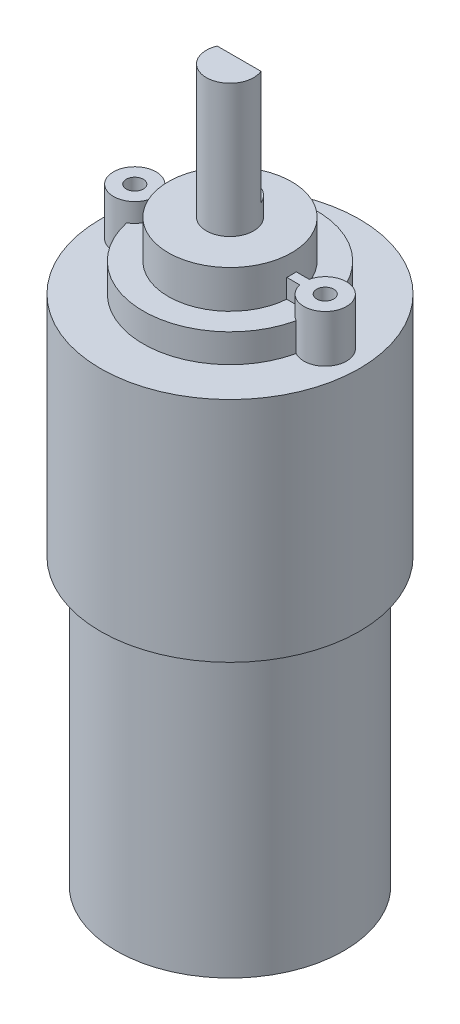
ISO-10303-21;
HEADER;
FILE_DESCRIPTION(('STEP AP214'),'2;1');
FILE_NAME('part.step','',(''),(''),'','','');
FILE_SCHEMA(('AUTOMOTIVE_DESIGN { 1 0 10303 214 1 1 1 1 }'));
ENDSEC;
DATA;
#1=APPLICATION_CONTEXT('core data for automotive mechanical design processes');
#2=APPLICATION_PROTOCOL_DEFINITION('international standard','automotive_design',2000,#1);
#3=PRODUCT_CONTEXT('',#1,'mechanical');
#4=PRODUCT('Part','Part','',(#3));
#5=PRODUCT_RELATED_PRODUCT_CATEGORY('part','',(#4));
#6=PRODUCT_DEFINITION_FORMATION('','',#4);
#7=PRODUCT_DEFINITION_CONTEXT('part definition',#1,'design');
#8=PRODUCT_DEFINITION('design','',#6,#7);
#9=PRODUCT_DEFINITION_SHAPE('','',#8);
#10=(LENGTH_UNIT() NAMED_UNIT(*) SI_UNIT(.MILLI.,.METRE.));
#11=(NAMED_UNIT(*) PLANE_ANGLE_UNIT() SI_UNIT($,.RADIAN.));
#12=(NAMED_UNIT(*) SI_UNIT($,.STERADIAN.) SOLID_ANGLE_UNIT());
#13=UNCERTAINTY_MEASURE_WITH_UNIT(LENGTH_MEASURE(1.E-05),#10,'distance_accuracy_value','');
#14=(GEOMETRIC_REPRESENTATION_CONTEXT(3) GLOBAL_UNCERTAINTY_ASSIGNED_CONTEXT((#13)) GLOBAL_UNIT_ASSIGNED_CONTEXT((#10,
#11,#12)) REPRESENTATION_CONTEXT('',''));
#15=CARTESIAN_POINT('',(0.,0.,0.));
#16=DIRECTION('',(0.,0.,1.));
#17=DIRECTION('',(1.,0.,0.));
#18=AXIS2_PLACEMENT_3D('',#15,#16,#17);
#19=CARTESIAN_POINT('',(0.,26.5,0.));
#20=DIRECTION('',(0.,1.,0.));
#21=DIRECTION('',(0.,0.,1.));
#22=AXIS2_PLACEMENT_3D('',#19,#20,#21);
#23=PLANE('',#22);
#24=DIRECTION('',(1.,0.,0.));
#25=VECTOR('',#24,1.);
#26=CARTESIAN_POINT('',(0.,26.5,0.500000000000004));
#27=LINE('',#26,#25);
#28=CARTESIAN_POINT('',(6.48074069840786,26.5,0.500000000000004));
#29=VERTEX_POINT('',#28);
#30=CARTESIAN_POINT('',(7.84625890315197,26.5,0.500000000000004));
#31=VERTEX_POINT('',#30);
#32=EDGE_CURVE('E162',#29,#31,#27,.T.);
#33=ORIENTED_EDGE('',*,*,#32,.F.);
#34=CARTESIAN_POINT('',(0.,26.5,0.));
#35=DIRECTION('',(0.,1.,0.));
#36=DIRECTION('',(0.,0.,1.));
#37=AXIS2_PLACEMENT_3D('',#34,#35,#36);
#38=CIRCLE('',#37,6.5);
#39=CARTESIAN_POINT('',(-6.48074069840786,26.5,0.500000000000004));
#40=VERTEX_POINT('',#39);
#41=EDGE_CURVE('E279',#40,#29,#38,.T.);
#42=ORIENTED_EDGE('',*,*,#41,.F.);
#43=CARTESIAN_POINT('',(-7.84625890315197,26.5,0.500000000000004));
#44=VERTEX_POINT('',#43);
#45=EDGE_CURVE('E305',#44,#40,#27,.T.);
#46=ORIENTED_EDGE('',*,*,#45,.F.);
#47=CARTESIAN_POINT('',(-10.04,26.5,0.));
#48=DIRECTION('',(0.,1.,0.));
#49=DIRECTION('',(0.,0.,1.));
#50=AXIS2_PLACEMENT_3D('',#47,#48,#49);
#51=CIRCLE('',#50,2.25);
#52=CARTESIAN_POINT('',(-8.93733067729084,26.5,1.96128028714819));
#53=VERTEX_POINT('',#52);
#54=EDGE_CURVE('E218',#44,#53,#51,.F.);
#55=ORIENTED_EDGE('',*,*,#54,.T.);
#56=CARTESIAN_POINT('',(0.,26.5,0.));
#57=DIRECTION('',(0.,1.,0.));
#58=DIRECTION('',(0.,0.,1.));
#59=AXIS2_PLACEMENT_3D('',#56,#57,#58);
#60=CIRCLE('',#59,9.15);
#61=CARTESIAN_POINT('',(8.93733067729083,26.5,1.9612802871482));
#62=VERTEX_POINT('',#61);
#63=EDGE_CURVE('E274',#53,#62,#60,.T.);
#64=ORIENTED_EDGE('',*,*,#63,.T.);
#65=CARTESIAN_POINT('',(10.04,26.5,0.));
#66=DIRECTION('',(0.,1.,0.));
#67=DIRECTION('',(0.,0.,1.));
#68=AXIS2_PLACEMENT_3D('',#65,#66,#67);
#69=CIRCLE('',#68,2.25);
#70=EDGE_CURVE('E233',#31,#62,#69,.T.);
#71=ORIENTED_EDGE('',*,*,#70,.F.);
#72=EDGE_LOOP('',(#33,#42,#46,#55,#64,#71));
#73=FACE_BOUND('',#72,.T.);
#74=ADVANCED_FACE('F35',(#73),#23,.T.);
#75=CARTESIAN_POINT('',(8.93733067729083,26.5,-1.9612802871482));
#76=VERTEX_POINT('',#75);
#77=CARTESIAN_POINT('',(7.84625890315197,26.5,-0.499999999999999));
#78=VERTEX_POINT('',#77);
#79=EDGE_CURVE('E236',#76,#78,#69,.T.);
#80=ORIENTED_EDGE('',*,*,#79,.F.);
#81=CARTESIAN_POINT('',(-8.93733067729083,26.5,-1.9612802871482));
#82=VERTEX_POINT('',#81);
#83=EDGE_CURVE('E327',#76,#82,#60,.T.);
#84=ORIENTED_EDGE('',*,*,#83,.T.);
#85=CARTESIAN_POINT('',(-7.84625890315197,26.5,-0.499999999999999));
#86=VERTEX_POINT('',#85);
#87=EDGE_CURVE('E214',#82,#86,#51,.F.);
#88=ORIENTED_EDGE('',*,*,#87,.T.);
#89=DIRECTION('',(1.,0.,0.));
#90=VECTOR('',#89,1.);
#91=CARTESIAN_POINT('',(0.,26.5,-0.499999999999999));
#92=LINE('',#91,#90);
#93=CARTESIAN_POINT('',(-6.48074069840786,26.5,-0.499999999999999));
#94=VERTEX_POINT('',#93);
#95=EDGE_CURVE('E303',#86,#94,#92,.T.);
#96=ORIENTED_EDGE('',*,*,#95,.T.);
#97=CARTESIAN_POINT('',(6.48074069840786,26.5,-0.499999999999999));
#98=VERTEX_POINT('',#97);
#99=EDGE_CURVE('E281',#98,#94,#38,.T.);
#100=ORIENTED_EDGE('',*,*,#99,.F.);
#101=EDGE_CURVE('E306',#98,#78,#92,.T.);
#102=ORIENTED_EDGE('',*,*,#101,.T.);
#103=EDGE_LOOP('',(#80,#84,#88,#96,#100,#102));
#104=FACE_BOUND('',#103,.T.);
#105=ADVANCED_FACE('F313',(#104),#23,.T.);
#106=CARTESIAN_POINT('',(0.,65.6871565633395,0.));
#107=DIRECTION('',(0.,1.,0.));
#108=DIRECTION('',(0.,0.,1.));
#109=AXIS2_PLACEMENT_3D('',#106,#107,#108);
#110=CYLINDRICAL_SURFACE('',#109,9.15);
#111=DIRECTION('',(0.,-1.,0.));
#112=VECTOR('',#111,1.);
#113=CARTESIAN_POINT('',(8.93733067729083,25.,-1.9612802871482));
#114=LINE('',#113,#112);
#115=CARTESIAN_POINT('',(8.93733067729083,23.5,-1.9612802871482));
#116=VERTEX_POINT('',#115);
#117=EDGE_CURVE('E235',#116,#76,#114,.F.);
#118=ORIENTED_EDGE('',*,*,#117,.F.);
#119=CARTESIAN_POINT('',(0.,23.5,0.));
#120=DIRECTION('',(0.,1.,0.));
#121=DIRECTION('',(0.,0.,1.));
#122=AXIS2_PLACEMENT_3D('',#119,#120,#121);
#123=CIRCLE('',#122,9.15);
#124=CARTESIAN_POINT('',(-8.93733067729083,23.5,-1.9612802871482));
#125=VERTEX_POINT('',#124);
#126=EDGE_CURVE('E334',#116,#125,#123,.T.);
#127=ORIENTED_EDGE('',*,*,#126,.T.);
#128=DIRECTION('',(0.,-1.,0.));
#129=VECTOR('',#128,1.);
#130=CARTESIAN_POINT('',(-8.93733067729083,25.,-1.9612802871482));
#131=LINE('',#130,#129);
#132=EDGE_CURVE('E211',#125,#82,#131,.F.);
#133=ORIENTED_EDGE('',*,*,#132,.T.);
#134=ORIENTED_EDGE('',*,*,#83,.F.);
#135=EDGE_LOOP('',(#118,#127,#133,#134));
#136=FACE_BOUND('',#135,.T.);
#137=ADVANCED_FACE('F333',(#136),#110,.T.);
#138=DIRECTION('',(0.,-1.,0.));
#139=VECTOR('',#138,1.);
#140=CARTESIAN_POINT('',(8.93733067729083,25.,1.9612802871482));
#141=LINE('',#140,#139);
#142=CARTESIAN_POINT('',(8.93733067729083,23.5,1.9612802871482));
#143=VERTEX_POINT('',#142);
#144=EDGE_CURVE('E230',#62,#143,#141,.T.);
#145=ORIENTED_EDGE('',*,*,#144,.F.);
#146=ORIENTED_EDGE('',*,*,#63,.F.);
#147=DIRECTION('',(0.,-1.,0.));
#148=VECTOR('',#147,1.);
#149=CARTESIAN_POINT('',(-8.93733067729083,25.,1.9612802871482));
#150=LINE('',#149,#148);
#151=CARTESIAN_POINT('',(-8.93733067729083,23.5,1.9612802871482));
#152=VERTEX_POINT('',#151);
#153=EDGE_CURVE('E217',#53,#152,#150,.T.);
#154=ORIENTED_EDGE('',*,*,#153,.T.);
#155=EDGE_CURVE('E269',#152,#143,#123,.T.);
#156=ORIENTED_EDGE('',*,*,#155,.T.);
#157=EDGE_LOOP('',(#145,#146,#154,#156));
#158=FACE_BOUND('',#157,.T.);
#159=ADVANCED_FACE('F373',(#158),#110,.T.);
#160=CARTESIAN_POINT('',(0.,23.5,0.));
#161=DIRECTION('',(0.,1.,0.));
#162=DIRECTION('',(0.,0.,1.));
#163=AXIS2_PLACEMENT_3D('',#160,#161,#162);
#164=PLANE('',#163);
#165=CARTESIAN_POINT('',(0.,23.5,0.));
#166=DIRECTION('',(0.,1.,0.));
#167=DIRECTION('',(0.,0.,1.));
#168=AXIS2_PLACEMENT_3D('',#165,#166,#167);
#169=CIRCLE('',#168,13.65);
#170=CARTESIAN_POINT('',(0.,23.5,13.65));
#171=VERTEX_POINT('',#170);
#172=EDGE_CURVE('E266',#171,#171,#169,.T.);
#173=ORIENTED_EDGE('',*,*,#172,.T.);
#174=EDGE_LOOP('',(#173));
#175=FACE_BOUND('',#174,.T.);
#176=CARTESIAN_POINT('',(10.04,23.5,0.));
#177=DIRECTION('',(0.,1.,0.));
#178=DIRECTION('',(0.,0.,1.));
#179=AXIS2_PLACEMENT_3D('',#176,#177,#178);
#180=CIRCLE('',#179,2.25);
#181=EDGE_CURVE('E300',#143,#116,#180,.T.);
#182=ORIENTED_EDGE('',*,*,#181,.F.);
#183=ORIENTED_EDGE('',*,*,#155,.F.);
#184=CARTESIAN_POINT('',(-10.04,23.5,0.));
#185=DIRECTION('',(0.,1.,0.));
#186=DIRECTION('',(0.,0.,1.));
#187=AXIS2_PLACEMENT_3D('',#184,#185,#186);
#188=CIRCLE('',#187,2.25);
#189=EDGE_CURVE('E294',#152,#125,#188,.F.);
#190=ORIENTED_EDGE('',*,*,#189,.T.);
#191=ORIENTED_EDGE('',*,*,#126,.F.);
#192=EDGE_LOOP('',(#182,#183,#190,#191));
#193=FACE_BOUND('',#192,.T.);
#194=ADVANCED_FACE('F362',(#175,#193),#164,.T.);
#195=CARTESIAN_POINT('',(0.,44.5,0.));
#196=DIRECTION('',(0.,1.,0.));
#197=DIRECTION('',(0.,0.,1.));
#198=AXIS2_PLACEMENT_3D('',#195,#196,#197);
#199=PLANE('',#198);
#200=DIRECTION('',(1.,0.,0.));
#201=VECTOR('',#200,1.);
#202=CARTESIAN_POINT('',(0.,44.5,-0.96));
#203=LINE('',#202,#201);
#204=CARTESIAN_POINT('',(-2.30833273164854,44.5,-0.96));
#205=VERTEX_POINT('',#204);
#206=CARTESIAN_POINT('',(2.30833273164854,44.5,-0.96));
#207=VERTEX_POINT('',#206);
#208=EDGE_CURVE('E246',#205,#207,#203,.T.);
#209=ORIENTED_EDGE('',*,*,#208,.F.);
#210=CARTESIAN_POINT('',(0.,44.5,0.));
#211=DIRECTION('',(0.,1.,0.));
#212=DIRECTION('',(0.,0.,1.));
#213=AXIS2_PLACEMENT_3D('',#210,#211,#212);
#214=CIRCLE('',#213,2.5);
#215=EDGE_CURVE('E288',#205,#207,#214,.T.);
#216=ORIENTED_EDGE('',*,*,#215,.T.);
#217=EDGE_LOOP('',(#209,#216));
#218=FACE_BOUND('',#217,.T.);
#219=ADVANCED_FACE('F37',(#218),#199,.T.);
#220=CARTESIAN_POINT('',(0.,65.6871565633395,0.));
#221=DIRECTION('',(0.,1.,0.));
#222=DIRECTION('',(0.,0.,1.));
#223=AXIS2_PLACEMENT_3D('',#220,#221,#222);
#224=CYLINDRICAL_SURFACE('',#223,2.5);
#225=DIRECTION('',(0.,1.,0.));
#226=VECTOR('',#225,1.);
#227=CARTESIAN_POINT('',(2.30833273164854,32.5,-0.96));
#228=LINE('',#227,#226);
#229=CARTESIAN_POINT('',(2.30833273164854,32.5,-0.96));
#230=VERTEX_POINT('',#229);
#231=EDGE_CURVE('E253',#230,#207,#228,.T.);
#232=ORIENTED_EDGE('',*,*,#231,.T.);
#233=ORIENTED_EDGE('',*,*,#215,.F.);
#234=DIRECTION('',(0.,1.,0.));
#235=VECTOR('',#234,1.);
#236=CARTESIAN_POINT('',(-2.30833273164854,32.5,-0.96));
#237=LINE('',#236,#235);
#238=CARTESIAN_POINT('',(-2.30833273164854,32.5,-0.96));
#239=VERTEX_POINT('',#238);
#240=EDGE_CURVE('E251',#239,#205,#237,.T.);
#241=ORIENTED_EDGE('',*,*,#240,.F.);
#242=CARTESIAN_POINT('',(0.,32.5,0.));
#243=DIRECTION('',(0.,1.,0.));
#244=DIRECTION('',(0.,0.,1.));
#245=AXIS2_PLACEMENT_3D('',#242,#243,#244);
#246=CIRCLE('',#245,2.5);
#247=EDGE_CURVE('E247',#230,#239,#246,.T.);
#248=ORIENTED_EDGE('',*,*,#247,.F.);
#249=EDGE_LOOP('',(#232,#233,#241,#248));
#250=FACE_BOUND('',#249,.T.);
#251=CARTESIAN_POINT('',(0.,30.5,0.));
#252=DIRECTION('',(0.,1.,0.));
#253=DIRECTION('',(0.,0.,1.));
#254=AXIS2_PLACEMENT_3D('',#251,#252,#253);
#255=CIRCLE('',#254,2.5);
#256=CARTESIAN_POINT('',(0.,30.5,2.5));
#257=VERTEX_POINT('',#256);
#258=EDGE_CURVE('E285',#257,#257,#255,.T.);
#259=ORIENTED_EDGE('',*,*,#258,.T.);
#260=EDGE_LOOP('',(#259));
#261=FACE_BOUND('',#260,.T.);
#262=ADVANCED_FACE('F569',(#250,#261),#224,.T.);
#263=CARTESIAN_POINT('',(0.,30.5,0.));
#264=DIRECTION('',(0.,1.,0.));
#265=DIRECTION('',(0.,0.,1.));
#266=AXIS2_PLACEMENT_3D('',#263,#264,#265);
#267=PLANE('',#266);
#268=CARTESIAN_POINT('',(0.,30.5,0.));
#269=DIRECTION('',(0.,1.,0.));
#270=DIRECTION('',(0.,0.,1.));
#271=AXIS2_PLACEMENT_3D('',#268,#269,#270);
#272=CIRCLE('',#271,6.5);
#273=CARTESIAN_POINT('',(0.,30.5,6.5));
#274=VERTEX_POINT('',#273);
#275=EDGE_CURVE('E282',#274,#274,#272,.T.);
#276=ORIENTED_EDGE('',*,*,#275,.T.);
#277=EDGE_LOOP('',(#276));
#278=FACE_BOUND('',#277,.T.);
#279=ORIENTED_EDGE('',*,*,#258,.F.);
#280=EDGE_LOOP('',(#279));
#281=FACE_BOUND('',#280,.T.);
#282=ADVANCED_FACE('F513',(#278,#281),#267,.T.);
#283=CARTESIAN_POINT('',(0.,65.6871565633395,0.));
#284=DIRECTION('',(0.,1.,0.));
#285=DIRECTION('',(0.,0.,1.));
#286=AXIS2_PLACEMENT_3D('',#283,#284,#285);
#287=CYLINDRICAL_SURFACE('',#286,6.5);
#288=DIRECTION('',(0.,1.,0.));
#289=VECTOR('',#288,1.);
#290=CARTESIAN_POINT('',(-6.48074069840786,65.6871565633395,0.500000000000004));
#291=LINE('',#290,#289);
#292=CARTESIAN_POINT('',(-6.48074069840786,28.5,0.500000000000004));
#293=VERTEX_POINT('',#292);
#294=EDGE_CURVE('E244',#40,#293,#291,.T.);
#295=ORIENTED_EDGE('',*,*,#294,.F.);
#296=ORIENTED_EDGE('',*,*,#41,.T.);
#297=DIRECTION('',(0.,1.,0.));
#298=VECTOR('',#297,1.);
#299=CARTESIAN_POINT('',(6.48074069840786,65.6871565633395,0.500000000000004));
#300=LINE('',#299,#298);
#301=CARTESIAN_POINT('',(6.48074069840786,28.5,0.500000000000004));
#302=VERTEX_POINT('',#301);
#303=EDGE_CURVE('E50',#302,#29,#300,.F.);
#304=ORIENTED_EDGE('',*,*,#303,.F.);
#305=CARTESIAN_POINT('',(0.,28.5,0.));
#306=DIRECTION('',(0.,1.,0.));
#307=DIRECTION('',(0.,0.,1.));
#308=AXIS2_PLACEMENT_3D('',#305,#306,#307);
#309=CIRCLE('',#308,6.5);
#310=CARTESIAN_POINT('',(6.48074069840786,28.5,-0.499999999999999));
#311=VERTEX_POINT('',#310);
#312=EDGE_CURVE('E39',#311,#302,#309,.F.);
#313=ORIENTED_EDGE('',*,*,#312,.F.);
#314=DIRECTION('',(0.,1.,0.));
#315=VECTOR('',#314,1.);
#316=CARTESIAN_POINT('',(6.48074069840786,65.6871565633395,-0.499999999999999));
#317=LINE('',#316,#315);
#318=EDGE_CURVE('E238',#311,#98,#317,.F.);
#319=ORIENTED_EDGE('',*,*,#318,.T.);
#320=ORIENTED_EDGE('',*,*,#99,.T.);
#321=DIRECTION('',(0.,1.,0.));
#322=VECTOR('',#321,1.);
#323=CARTESIAN_POINT('',(-6.48074069840786,65.6871565633395,-0.499999999999999));
#324=LINE('',#323,#322);
#325=CARTESIAN_POINT('',(-6.48074069840786,28.5,-0.499999999999999));
#326=VERTEX_POINT('',#325);
#327=EDGE_CURVE('E240',#94,#326,#324,.T.);
#328=ORIENTED_EDGE('',*,*,#327,.T.);
#329=EDGE_CURVE('E11',#293,#326,#309,.F.);
#330=ORIENTED_EDGE('',*,*,#329,.F.);
#331=EDGE_LOOP('',(#295,#296,#304,#313,#319,#320,#328,#330));
#332=FACE_BOUND('',#331,.T.);
#333=ORIENTED_EDGE('',*,*,#275,.F.);
#334=EDGE_LOOP('',(#333));
#335=FACE_BOUND('',#334,.T.);
#336=ADVANCED_FACE('F320',(#332,#335),#287,.T.);
#337=CARTESIAN_POINT('',(0.,65.6871565633395,0.));
#338=DIRECTION('',(0.,1.,0.));
#339=DIRECTION('',(0.,0.,1.));
#340=AXIS2_PLACEMENT_3D('',#337,#338,#339);
#341=CYLINDRICAL_SURFACE('',#340,13.65);
#342=CARTESIAN_POINT('',(0.,-0.5,0.));
#343=DIRECTION('',(0.,1.,0.));
#344=DIRECTION('',(0.,0.,1.));
#345=AXIS2_PLACEMENT_3D('',#342,#343,#344);
#346=CIRCLE('',#345,13.65);
#347=CARTESIAN_POINT('',(0.,-0.5,13.65));
#348=VERTEX_POINT('',#347);
#349=EDGE_CURVE('E263',#348,#348,#346,.T.);
#350=ORIENTED_EDGE('',*,*,#349,.T.);
#351=EDGE_LOOP('',(#350));
#352=FACE_BOUND('',#351,.T.);
#353=ORIENTED_EDGE('',*,*,#172,.F.);
#354=EDGE_LOOP('',(#353));
#355=FACE_BOUND('',#354,.T.);
#356=ADVANCED_FACE('F512',(#352,#355),#341,.T.);
#357=CARTESIAN_POINT('',(0.,-0.5,0.));
#358=DIRECTION('',(0.,-1.,0.));
#359=DIRECTION('',(0.,0.,-1.));
#360=AXIS2_PLACEMENT_3D('',#357,#358,#359);
#361=PLANE('',#360);
#362=CARTESIAN_POINT('',(0.,-0.5,0.));
#363=DIRECTION('',(0.,1.,0.));
#364=DIRECTION('',(0.,0.,1.));
#365=AXIS2_PLACEMENT_3D('',#362,#363,#364);
#366=CIRCLE('',#365,12.);
#367=CARTESIAN_POINT('',(0.,-0.5,12.));
#368=VERTEX_POINT('',#367);
#369=EDGE_CURVE('E260',#368,#368,#366,.T.);
#370=ORIENTED_EDGE('',*,*,#369,.T.);
#371=EDGE_LOOP('',(#370));
#372=FACE_BOUND('',#371,.T.);
#373=ORIENTED_EDGE('',*,*,#349,.F.);
#374=EDGE_LOOP('',(#373));
#375=FACE_BOUND('',#374,.T.);
#376=ADVANCED_FACE('F598',(#372,#375),#361,.T.);
#377=CARTESIAN_POINT('',(0.,65.6871565633395,0.));
#378=DIRECTION('',(0.,1.,0.));
#379=DIRECTION('',(0.,0.,1.));
#380=AXIS2_PLACEMENT_3D('',#377,#378,#379);
#381=CYLINDRICAL_SURFACE('',#380,12.);
#382=CARTESIAN_POINT('',(0.,-30.5,0.));
#383=DIRECTION('',(0.,1.,0.));
#384=DIRECTION('',(0.,0.,1.));
#385=AXIS2_PLACEMENT_3D('',#382,#383,#384);
#386=CIRCLE('',#385,12.);
#387=CARTESIAN_POINT('',(0.,-30.5,12.));
#388=VERTEX_POINT('',#387);
#389=EDGE_CURVE('E256',#388,#388,#386,.T.);
#390=ORIENTED_EDGE('',*,*,#389,.T.);
#391=EDGE_LOOP('',(#390));
#392=FACE_BOUND('',#391,.T.);
#393=ORIENTED_EDGE('',*,*,#369,.F.);
#394=EDGE_LOOP('',(#393));
#395=FACE_BOUND('',#394,.T.);
#396=ADVANCED_FACE('F588',(#392,#395),#381,.T.);
#397=CARTESIAN_POINT('',(0.,-30.5,0.));
#398=DIRECTION('',(0.,-1.,0.));
#399=DIRECTION('',(0.,0.,-1.));
#400=AXIS2_PLACEMENT_3D('',#397,#398,#399);
#401=PLANE('',#400);
#402=ORIENTED_EDGE('',*,*,#389,.F.);
#403=EDGE_LOOP('',(#402));
#404=FACE_BOUND('',#403,.T.);
#405=ADVANCED_FACE('F561',(#404),#401,.T.);
#406=CARTESIAN_POINT('',(0.,32.5,-0.96));
#407=DIRECTION('',(0.,0.,1.));
#408=DIRECTION('',(1.,0.,0.));
#409=AXIS2_PLACEMENT_3D('',#406,#407,#408);
#410=PLANE('',#409);
#411=ORIENTED_EDGE('',*,*,#208,.T.);
#412=ORIENTED_EDGE('',*,*,#231,.F.);
#413=DIRECTION('',(1.,0.,0.));
#414=VECTOR('',#413,1.);
#415=CARTESIAN_POINT('',(0.,32.5,-0.96));
#416=LINE('',#415,#414);
#417=EDGE_CURVE('E249',#239,#230,#416,.T.);
#418=ORIENTED_EDGE('',*,*,#417,.F.);
#419=ORIENTED_EDGE('',*,*,#240,.T.);
#420=EDGE_LOOP('',(#411,#412,#418,#419));
#421=FACE_BOUND('',#420,.T.);
#422=ADVANCED_FACE('F551',(#421),#410,.F.);
#423=CARTESIAN_POINT('',(0.,32.5,0.));
#424=DIRECTION('',(0.,1.,0.));
#425=DIRECTION('',(0.,0.,1.));
#426=AXIS2_PLACEMENT_3D('',#423,#424,#425);
#427=PLANE('',#426);
#428=ORIENTED_EDGE('',*,*,#247,.T.);
#429=ORIENTED_EDGE('',*,*,#417,.T.);
#430=EDGE_LOOP('',(#428,#429));
#431=FACE_BOUND('',#430,.T.);
#432=ADVANCED_FACE('F502',(#431),#427,.T.);
#433=CARTESIAN_POINT('',(-10.04,28.5,0.));
#434=DIRECTION('',(0.,-1.,0.));
#435=DIRECTION('',(0.,0.,-1.));
#436=AXIS2_PLACEMENT_3D('',#433,#434,#435);
#437=CYLINDRICAL_SURFACE('',#436,2.25);
#438=ORIENTED_EDGE('',*,*,#54,.F.);
#439=DIRECTION('',(0.,-1.,0.));
#440=VECTOR('',#439,1.);
#441=CARTESIAN_POINT('',(-7.84625890315197,28.5,0.500000000000004));
#442=LINE('',#441,#440);
#443=CARTESIAN_POINT('',(-7.84625890315197,28.5,0.500000000000004));
#444=VERTEX_POINT('',#443);
#445=EDGE_CURVE('E196',#444,#44,#442,.T.);
#446=ORIENTED_EDGE('',*,*,#445,.F.);
#447=CARTESIAN_POINT('',(-10.04,28.5,0.));
#448=DIRECTION('',(0.,1.,0.));
#449=DIRECTION('',(0.,0.,1.));
#450=AXIS2_PLACEMENT_3D('',#447,#448,#449);
#451=CIRCLE('',#450,2.25);
#452=CARTESIAN_POINT('',(-7.84625890315197,28.5,-0.499999999999999));
#453=VERTEX_POINT('',#452);
#454=EDGE_CURVE('E187',#453,#444,#451,.T.);
#455=ORIENTED_EDGE('',*,*,#454,.F.);
#456=DIRECTION('',(0.,-1.,0.));
#457=VECTOR('',#456,1.);
#458=CARTESIAN_POINT('',(-7.84625890315197,28.5,-0.499999999999999));
#459=LINE('',#458,#457);
#460=EDGE_CURVE('E199',#453,#86,#459,.T.);
#461=ORIENTED_EDGE('',*,*,#460,.T.);
#462=ORIENTED_EDGE('',*,*,#87,.F.);
#463=ORIENTED_EDGE('',*,*,#132,.F.);
#464=ORIENTED_EDGE('',*,*,#189,.F.);
#465=ORIENTED_EDGE('',*,*,#153,.F.);
#466=EDGE_LOOP('',(#438,#446,#455,#461,#462,#463,#464,#465));
#467=FACE_BOUND('',#466,.T.);
#468=ADVANCED_FACE('F329',(#467),#437,.T.);
#469=CARTESIAN_POINT('',(0.,28.5,-0.499999999999999));
#470=DIRECTION('',(0.,0.,1.));
#471=DIRECTION('',(1.,0.,0.));
#472=AXIS2_PLACEMENT_3D('',#469,#470,#471);
#473=PLANE('',#472);
#474=ORIENTED_EDGE('',*,*,#327,.F.);
#475=ORIENTED_EDGE('',*,*,#95,.F.);
#476=ORIENTED_EDGE('',*,*,#460,.F.);
#477=DIRECTION('',(-1.,0.,0.));
#478=VECTOR('',#477,1.);
#479=CARTESIAN_POINT('',(0.,28.5,-0.499999999999999));
#480=LINE('',#479,#478);
#481=EDGE_CURVE('E182',#326,#453,#480,.T.);
#482=ORIENTED_EDGE('',*,*,#481,.F.);
#483=EDGE_LOOP('',(#474,#475,#476,#482));
#484=FACE_BOUND('',#483,.T.);
#485=ADVANCED_FACE('F325',(#484),#473,.F.);
#486=CARTESIAN_POINT('',(0.,28.5,0.500000000000004));
#487=DIRECTION('',(0.,0.,1.));
#488=DIRECTION('',(1.,0.,0.));
#489=AXIS2_PLACEMENT_3D('',#486,#487,#488);
#490=PLANE('',#489);
#491=ORIENTED_EDGE('',*,*,#45,.T.);
#492=ORIENTED_EDGE('',*,*,#294,.T.);
#493=DIRECTION('',(-1.,0.,0.));
#494=VECTOR('',#493,1.);
#495=CARTESIAN_POINT('',(0.,28.5,0.500000000000004));
#496=LINE('',#495,#494);
#497=EDGE_CURVE('E175',#293,#444,#496,.T.);
#498=ORIENTED_EDGE('',*,*,#497,.T.);
#499=ORIENTED_EDGE('',*,*,#445,.T.);
#500=EDGE_LOOP('',(#491,#492,#498,#499));
#501=FACE_BOUND('',#500,.T.);
#502=ADVANCED_FACE('F389',(#501),#490,.T.);
#503=CARTESIAN_POINT('',(-10.04,28.5,0.));
#504=DIRECTION('',(0.,-1.,0.));
#505=DIRECTION('',(0.,0.,-1.));
#506=AXIS2_PLACEMENT_3D('',#503,#504,#505);
#507=CYLINDRICAL_SURFACE('',#506,0.9);
#508=CARTESIAN_POINT('',(-10.04,28.5,0.));
#509=DIRECTION('',(0.,1.,0.));
#510=DIRECTION('',(0.,0.,1.));
#511=AXIS2_PLACEMENT_3D('',#508,#509,#510);
#512=CIRCLE('',#511,0.9);
#513=CARTESIAN_POINT('',(-10.04,28.5,0.900000000000001));
#514=VERTEX_POINT('',#513);
#515=EDGE_CURVE('E193',#514,#514,#512,.T.);
#516=ORIENTED_EDGE('',*,*,#515,.T.);
#517=EDGE_LOOP('',(#516));
#518=FACE_BOUND('',#517,.T.);
#519=CARTESIAN_POINT('',(-10.04,26.5,0.));
#520=DIRECTION('',(0.,1.,0.));
#521=DIRECTION('',(0.,0.,1.));
#522=AXIS2_PLACEMENT_3D('',#519,#520,#521);
#523=CIRCLE('',#522,0.9);
#524=CARTESIAN_POINT('',(-9.14910856573705,26.5,-0.12772021123107));
#525=VERTEX_POINT('',#524);
#526=CARTESIAN_POINT('',(-9.14910856573705,26.5,0.127720211231075));
#527=VERTEX_POINT('',#526);
#528=EDGE_CURVE('E205',#525,#527,#523,.F.);
#529=ORIENTED_EDGE('',*,*,#528,.T.);
#530=DIRECTION('',(0.,-1.,0.));
#531=VECTOR('',#530,1.);
#532=CARTESIAN_POINT('',(-9.14910856573705,26.,0.127720211231075));
#533=LINE('',#532,#531);
#534=CARTESIAN_POINT('',(-9.14910856573705,23.5,0.127720211231075));
#535=VERTEX_POINT('',#534);
#536=EDGE_CURVE('E208',#527,#535,#533,.T.);
#537=ORIENTED_EDGE('',*,*,#536,.T.);
#538=CARTESIAN_POINT('',(-10.04,23.5,0.));
#539=DIRECTION('',(0.,1.,0.));
#540=DIRECTION('',(0.,0.,1.));
#541=AXIS2_PLACEMENT_3D('',#538,#539,#540);
#542=CIRCLE('',#541,0.9);
#543=CARTESIAN_POINT('',(-9.14910856573705,23.5,-0.127720211231072));
#544=VERTEX_POINT('',#543);
#545=EDGE_CURVE('E291',#535,#544,#542,.F.);
#546=ORIENTED_EDGE('',*,*,#545,.T.);
#547=DIRECTION('',(0.,-1.,0.));
#548=VECTOR('',#547,1.);
#549=CARTESIAN_POINT('',(-9.14910856573705,26.,-0.127720211231072));
#550=LINE('',#549,#548);
#551=EDGE_CURVE('E166',#544,#525,#550,.F.);
#552=ORIENTED_EDGE('',*,*,#551,.T.);
#553=EDGE_LOOP('',(#529,#537,#546,#552));
#554=FACE_BOUND('',#553,.T.);
#555=ADVANCED_FACE('F345',(#518,#554),#507,.F.);
#556=CARTESIAN_POINT('',(0.,28.5,0.));
#557=DIRECTION('',(0.,1.,0.));
#558=DIRECTION('',(0.,0.,1.));
#559=AXIS2_PLACEMENT_3D('',#556,#557,#558);
#560=PLANE('',#559);
#561=ORIENTED_EDGE('',*,*,#515,.F.);
#562=EDGE_LOOP('',(#561));
#563=FACE_BOUND('',#562,.T.);
#564=ORIENTED_EDGE('',*,*,#497,.F.);
#565=ORIENTED_EDGE('',*,*,#329,.T.);
#566=ORIENTED_EDGE('',*,*,#481,.T.);
#567=ORIENTED_EDGE('',*,*,#454,.T.);
#568=EDGE_LOOP('',(#564,#565,#566,#567));
#569=FACE_BOUND('',#568,.T.);
#570=ADVANCED_FACE('F370',(#563,#569),#560,.T.);
#571=ORIENTED_EDGE('',*,*,#545,.F.);
#572=EDGE_CURVE('E272',#544,#535,#123,.T.);
#573=ORIENTED_EDGE('',*,*,#572,.F.);
#574=EDGE_LOOP('',(#571,#573));
#575=FACE_BOUND('',#574,.T.);
#576=ADVANCED_FACE('F363',(#575),#164,.T.);
#577=ORIENTED_EDGE('',*,*,#536,.F.);
#578=EDGE_CURVE('E277',#525,#527,#60,.T.);
#579=ORIENTED_EDGE('',*,*,#578,.F.);
#580=ORIENTED_EDGE('',*,*,#551,.F.);
#581=ORIENTED_EDGE('',*,*,#572,.T.);
#582=EDGE_LOOP('',(#577,#579,#580,#581));
#583=FACE_BOUND('',#582,.T.);
#584=ADVANCED_FACE('F340',(#583),#110,.T.);
#585=ORIENTED_EDGE('',*,*,#528,.F.);
#586=ORIENTED_EDGE('',*,*,#578,.T.);
#587=EDGE_LOOP('',(#585,#586));
#588=FACE_BOUND('',#587,.T.);
#589=ADVANCED_FACE('F347',(#588),#23,.T.);
#590=CARTESIAN_POINT('',(7.84625890315197,28.5,0.500000000000004));
#591=VERTEX_POINT('',#590);
#592=EDGE_CURVE('E161',#591,#302,#496,.T.);
#593=ORIENTED_EDGE('',*,*,#592,.T.);
#594=ORIENTED_EDGE('',*,*,#303,.T.);
#595=ORIENTED_EDGE('',*,*,#32,.T.);
#596=DIRECTION('',(0.,-1.,0.));
#597=VECTOR('',#596,1.);
#598=CARTESIAN_POINT('',(7.84625890315197,28.5,0.500000000000004));
#599=LINE('',#598,#597);
#600=EDGE_CURVE('E158',#591,#31,#599,.T.);
#601=ORIENTED_EDGE('',*,*,#600,.F.);
#602=EDGE_LOOP('',(#593,#594,#595,#601));
#603=FACE_BOUND('',#602,.T.);
#604=ADVANCED_FACE('F160',(#603),#490,.T.);
#605=CARTESIAN_POINT('',(10.04,28.5,0.));
#606=DIRECTION('',(0.,-1.,0.));
#607=DIRECTION('',(0.,0.,-1.));
#608=AXIS2_PLACEMENT_3D('',#605,#606,#607);
#609=CYLINDRICAL_SURFACE('',#608,2.25);
#610=ORIENTED_EDGE('',*,*,#117,.T.);
#611=ORIENTED_EDGE('',*,*,#79,.T.);
#612=DIRECTION('',(0.,-1.,0.));
#613=VECTOR('',#612,1.);
#614=CARTESIAN_POINT('',(7.84625890315197,28.5,-0.499999999999999));
#615=LINE('',#614,#613);
#616=CARTESIAN_POINT('',(7.84625890315197,28.5,-0.499999999999999));
#617=VERTEX_POINT('',#616);
#618=EDGE_CURVE('E167',#617,#78,#615,.T.);
#619=ORIENTED_EDGE('',*,*,#618,.F.);
#620=CARTESIAN_POINT('',(10.04,28.5,0.));
#621=DIRECTION('',(0.,1.,0.));
#622=DIRECTION('',(0.,0.,1.));
#623=AXIS2_PLACEMENT_3D('',#620,#621,#622);
#624=CIRCLE('',#623,2.25);
#625=EDGE_CURVE('E174',#617,#591,#624,.F.);
#626=ORIENTED_EDGE('',*,*,#625,.T.);
#627=ORIENTED_EDGE('',*,*,#600,.T.);
#628=ORIENTED_EDGE('',*,*,#70,.T.);
#629=ORIENTED_EDGE('',*,*,#144,.T.);
#630=ORIENTED_EDGE('',*,*,#181,.T.);
#631=EDGE_LOOP('',(#610,#611,#619,#626,#627,#628,#629,#630));
#632=FACE_BOUND('',#631,.T.);
#633=ADVANCED_FACE('F178',(#632),#609,.T.);
#634=ORIENTED_EDGE('',*,*,#318,.F.);
#635=EDGE_CURVE('E184',#617,#311,#480,.T.);
#636=ORIENTED_EDGE('',*,*,#635,.F.);
#637=ORIENTED_EDGE('',*,*,#618,.T.);
#638=ORIENTED_EDGE('',*,*,#101,.F.);
#639=EDGE_LOOP('',(#634,#636,#637,#638));
#640=FACE_BOUND('',#639,.T.);
#641=ADVANCED_FACE('F319',(#640),#473,.F.);
#642=CARTESIAN_POINT('',(10.04,28.5,0.));
#643=DIRECTION('',(0.,-1.,0.));
#644=DIRECTION('',(0.,0.,-1.));
#645=AXIS2_PLACEMENT_3D('',#642,#643,#644);
#646=CYLINDRICAL_SURFACE('',#645,0.9);
#647=DIRECTION('',(0.,-1.,0.));
#648=VECTOR('',#647,1.);
#649=CARTESIAN_POINT('',(9.14910856573705,26.,-0.127720211231072));
#650=LINE('',#649,#648);
#651=CARTESIAN_POINT('',(9.14910856573705,23.5,-0.127720211231072));
#652=VERTEX_POINT('',#651);
#653=CARTESIAN_POINT('',(9.14910856573705,26.5,-0.127720211231072));
#654=VERTEX_POINT('',#653);
#655=EDGE_CURVE('E227',#652,#654,#650,.F.);
#656=ORIENTED_EDGE('',*,*,#655,.F.);
#657=CARTESIAN_POINT('',(10.04,23.5,0.));
#658=DIRECTION('',(0.,1.,0.));
#659=DIRECTION('',(0.,0.,1.));
#660=AXIS2_PLACEMENT_3D('',#657,#658,#659);
#661=CIRCLE('',#660,0.9);
#662=CARTESIAN_POINT('',(9.14910856573705,23.5,0.127720211231075));
#663=VERTEX_POINT('',#662);
#664=EDGE_CURVE('E297',#663,#652,#661,.T.);
#665=ORIENTED_EDGE('',*,*,#664,.F.);
#666=DIRECTION('',(0.,-1.,0.));
#667=VECTOR('',#666,1.);
#668=CARTESIAN_POINT('',(9.14910856573705,26.,0.127720211231075));
#669=LINE('',#668,#667);
#670=CARTESIAN_POINT('',(9.14910856573705,26.5,0.127720211231075));
#671=VERTEX_POINT('',#670);
#672=EDGE_CURVE('E221',#671,#663,#669,.T.);
#673=ORIENTED_EDGE('',*,*,#672,.F.);
#674=CARTESIAN_POINT('',(10.04,26.5,0.));
#675=DIRECTION('',(0.,1.,0.));
#676=DIRECTION('',(0.,0.,1.));
#677=AXIS2_PLACEMENT_3D('',#674,#675,#676);
#678=CIRCLE('',#677,0.9);
#679=EDGE_CURVE('E224',#654,#671,#678,.T.);
#680=ORIENTED_EDGE('',*,*,#679,.F.);
#681=EDGE_LOOP('',(#656,#665,#673,#680));
#682=FACE_BOUND('',#681,.T.);
#683=CARTESIAN_POINT('',(10.04,28.5,0.));
#684=DIRECTION('',(0.,1.,0.));
#685=DIRECTION('',(0.,0.,1.));
#686=AXIS2_PLACEMENT_3D('',#683,#684,#685);
#687=CIRCLE('',#686,0.9);
#688=CARTESIAN_POINT('',(10.04,28.5,0.900000000000001));
#689=VERTEX_POINT('',#688);
#690=EDGE_CURVE('E190',#689,#689,#687,.F.);
#691=ORIENTED_EDGE('',*,*,#690,.F.);
#692=EDGE_LOOP('',(#691));
#693=FACE_BOUND('',#692,.T.);
#694=ADVANCED_FACE('F356',(#682,#693),#646,.F.);
#695=ORIENTED_EDGE('',*,*,#635,.T.);
#696=ORIENTED_EDGE('',*,*,#312,.T.);
#697=ORIENTED_EDGE('',*,*,#592,.F.);
#698=ORIENTED_EDGE('',*,*,#625,.F.);
#699=EDGE_LOOP('',(#695,#696,#697,#698));
#700=FACE_BOUND('',#699,.T.);
#701=ORIENTED_EDGE('',*,*,#690,.T.);
#702=EDGE_LOOP('',(#701));
#703=FACE_BOUND('',#702,.T.);
#704=ADVANCED_FACE('F172',(#700,#703),#560,.T.);
#705=EDGE_CURVE('E273',#663,#652,#123,.T.);
#706=ORIENTED_EDGE('',*,*,#705,.F.);
#707=ORIENTED_EDGE('',*,*,#664,.T.);
#708=EDGE_LOOP('',(#706,#707));
#709=FACE_BOUND('',#708,.T.);
#710=ADVANCED_FACE('F359',(#709),#164,.T.);
#711=ORIENTED_EDGE('',*,*,#705,.T.);
#712=ORIENTED_EDGE('',*,*,#655,.T.);
#713=EDGE_CURVE('E278',#671,#654,#60,.T.);
#714=ORIENTED_EDGE('',*,*,#713,.F.);
#715=ORIENTED_EDGE('',*,*,#672,.T.);
#716=EDGE_LOOP('',(#711,#712,#714,#715));
#717=FACE_BOUND('',#716,.T.);
#718=ADVANCED_FACE('F353',(#717),#110,.T.);
#719=ORIENTED_EDGE('',*,*,#713,.T.);
#720=ORIENTED_EDGE('',*,*,#679,.T.);
#721=EDGE_LOOP('',(#719,#720));
#722=FACE_BOUND('',#721,.T.);
#723=ADVANCED_FACE('F351',(#722),#23,.T.);
#724=CLOSED_SHELL('',(#74,#105,#137,#159,#194,#219,#262,#282,#336,#356,#376,#396,#405,#422,#432,
#468,#485,#502,#555,#570,#576,#584,#589,#604,#633,#641,#694,#704,#710,#718,#723));
#725=MANIFOLD_SOLID_BREP('B2',#724);
#726=ADVANCED_BREP_SHAPE_REPRESENTATION('',(#18,#725),#14);
#727=SHAPE_DEFINITION_REPRESENTATION(#9,#726);
ENDSEC;
END-ISO-10303-21;
